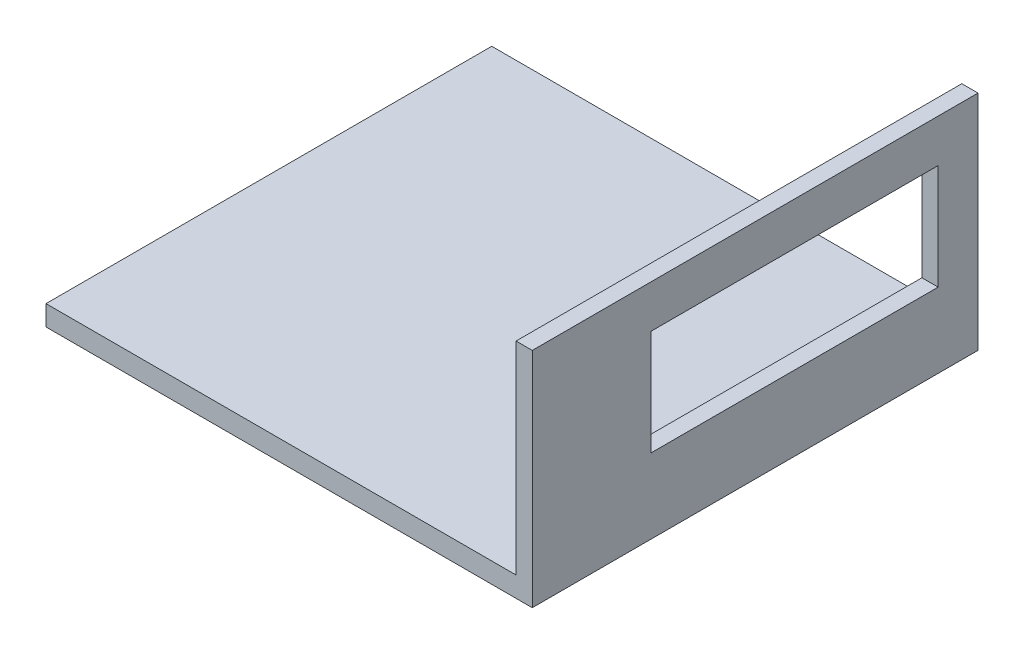
ISO-10303-21;
HEADER;
FILE_DESCRIPTION(('STEP AP214'),'2;1');
FILE_NAME('part.step','',(''),(''),'','','');
FILE_SCHEMA(('AUTOMOTIVE_DESIGN { 1 0 10303 214 1 1 1 1 }'));
ENDSEC;
DATA;
#1=APPLICATION_CONTEXT('core data for automotive mechanical design processes');
#2=APPLICATION_PROTOCOL_DEFINITION('international standard','automotive_design',2000,#1);
#3=PRODUCT_CONTEXT('',#1,'mechanical');
#4=PRODUCT('Part','Part','',(#3));
#5=PRODUCT_RELATED_PRODUCT_CATEGORY('part','',(#4));
#6=PRODUCT_DEFINITION_FORMATION('','',#4);
#7=PRODUCT_DEFINITION_CONTEXT('part definition',#1,'design');
#8=PRODUCT_DEFINITION('design','',#6,#7);
#9=PRODUCT_DEFINITION_SHAPE('','',#8);
#10=(LENGTH_UNIT() NAMED_UNIT(*) SI_UNIT(.MILLI.,.METRE.));
#11=(NAMED_UNIT(*) PLANE_ANGLE_UNIT() SI_UNIT($,.RADIAN.));
#12=(NAMED_UNIT(*) SI_UNIT($,.STERADIAN.) SOLID_ANGLE_UNIT());
#13=UNCERTAINTY_MEASURE_WITH_UNIT(LENGTH_MEASURE(1.E-05),#10,'distance_accuracy_value','');
#14=(GEOMETRIC_REPRESENTATION_CONTEXT(3) GLOBAL_UNCERTAINTY_ASSIGNED_CONTEXT((#13)) GLOBAL_UNIT_ASSIGNED_CONTEXT((#10,
#11,#12)) REPRESENTATION_CONTEXT('',''));
#15=CARTESIAN_POINT('',(0.,0.,0.));
#16=DIRECTION('',(0.,0.,1.));
#17=DIRECTION('',(1.,0.,0.));
#18=AXIS2_PLACEMENT_3D('',#15,#16,#17);
#19=CARTESIAN_POINT('',(0.,5.,0.));
#20=DIRECTION('',(0.,-1.,0.));
#21=DIRECTION('',(0.,0.,-1.));
#22=AXIS2_PLACEMENT_3D('',#19,#20,#21);
#23=PLANE('',#22);
#24=DIRECTION('',(0.,0.,1.));
#25=VECTOR('',#24,1.);
#26=CARTESIAN_POINT('',(56.,5.,55.));
#27=LINE('',#26,#25);
#28=CARTESIAN_POINT('',(55.9999999999999,5.,-55.));
#29=VERTEX_POINT('',#28);
#30=CARTESIAN_POINT('',(56.,5.,55.));
#31=VERTEX_POINT('',#30);
#32=EDGE_CURVE('E126',#29,#31,#27,.T.);
#33=ORIENTED_EDGE('',*,*,#32,.F.);
#34=DIRECTION('',(-1.,0.,0.));
#35=VECTOR('',#34,1.);
#36=CARTESIAN_POINT('',(-60.,5.,-55.));
#37=LINE('',#36,#35);
#38=CARTESIAN_POINT('',(-60.,5.,-55.));
#39=VERTEX_POINT('',#38);
#40=EDGE_CURVE('E192',#29,#39,#37,.T.);
#41=ORIENTED_EDGE('',*,*,#40,.T.);
#42=DIRECTION('',(0.,0.,1.));
#43=VECTOR('',#42,1.);
#44=CARTESIAN_POINT('',(-60.,5.,55.));
#45=LINE('',#44,#43);
#46=CARTESIAN_POINT('',(-60.,5.,55.));
#47=VERTEX_POINT('',#46);
#48=EDGE_CURVE('E199',#39,#47,#45,.T.);
#49=ORIENTED_EDGE('',*,*,#48,.T.);
#50=DIRECTION('',(1.,0.,0.));
#51=VECTOR('',#50,1.);
#52=CARTESIAN_POINT('',(-60.,5.,55.));
#53=LINE('',#52,#51);
#54=EDGE_CURVE('E168',#47,#31,#53,.T.);
#55=ORIENTED_EDGE('',*,*,#54,.T.);
#56=EDGE_LOOP('',(#33,#41,#49,#55));
#57=FACE_BOUND('',#56,.T.);
#58=ADVANCED_FACE('F33',(#57),#23,.F.);
#59=CARTESIAN_POINT('',(60.,5.,55.));
#60=DIRECTION('',(-1.,0.,0.));
#61=DIRECTION('',(0.,0.,1.));
#62=AXIS2_PLACEMENT_3D('',#59,#60,#61);
#63=PLANE('',#62);
#64=DIRECTION('',(0.,0.,-1.));
#65=VECTOR('',#64,1.);
#66=CARTESIAN_POINT('',(60.,18.4414610303207,25.7586442922975));
#67=LINE('',#66,#65);
#68=CARTESIAN_POINT('',(60.,18.4414610303207,25.7586442922975));
#69=VERTEX_POINT('',#68);
#70=CARTESIAN_POINT('',(60.,18.4414610303207,-45.1614693567457));
#71=VERTEX_POINT('',#70);
#72=EDGE_CURVE('E134',#69,#71,#67,.T.);
#73=ORIENTED_EDGE('',*,*,#72,.F.);
#74=DIRECTION('',(0.,-1.,0.));
#75=VECTOR('',#74,1.);
#76=CARTESIAN_POINT('',(60.,18.4414610303207,25.7586442922975));
#77=LINE('',#76,#75);
#78=CARTESIAN_POINT('',(60.,44.4295497391849,25.7586442922975));
#79=VERTEX_POINT('',#78);
#80=EDGE_CURVE('E50',#79,#69,#77,.T.);
#81=ORIENTED_EDGE('',*,*,#80,.F.);
#82=DIRECTION('',(0.,0.,1.));
#83=VECTOR('',#82,1.);
#84=CARTESIAN_POINT('',(60.,44.4295497391849,25.7586442922975));
#85=LINE('',#84,#83);
#86=CARTESIAN_POINT('',(60.,44.4295497391849,-45.1614693567457));
#87=VERTEX_POINT('',#86);
#88=EDGE_CURVE('E120',#87,#79,#85,.T.);
#89=ORIENTED_EDGE('',*,*,#88,.F.);
#90=DIRECTION('',(0.,1.,0.));
#91=VECTOR('',#90,1.);
#92=CARTESIAN_POINT('',(60.,18.4414610303207,-45.1614693567457));
#93=LINE('',#92,#91);
#94=EDGE_CURVE('E140',#71,#87,#93,.T.);
#95=ORIENTED_EDGE('',*,*,#94,.F.);
#96=EDGE_LOOP('',(#73,#81,#89,#95));
#97=FACE_BOUND('',#96,.T.);
#98=DIRECTION('',(0.,0.,-1.));
#99=VECTOR('',#98,1.);
#100=CARTESIAN_POINT('',(60.,0.,55.));
#101=LINE('',#100,#99);
#102=CARTESIAN_POINT('',(60.,0.,55.));
#103=VERTEX_POINT('',#102);
#104=CARTESIAN_POINT('',(60.,0.,-55.));
#105=VERTEX_POINT('',#104);
#106=EDGE_CURVE('E176',#103,#105,#101,.T.);
#107=ORIENTED_EDGE('',*,*,#106,.T.);
#108=DIRECTION('',(0.,-1.,0.));
#109=VECTOR('',#108,1.);
#110=CARTESIAN_POINT('',(60.,5.,-55.));
#111=LINE('',#110,#109);
#112=CARTESIAN_POINT('',(60.,55.,-55.));
#113=VERTEX_POINT('',#112);
#114=EDGE_CURVE('E11',#113,#105,#111,.T.);
#115=ORIENTED_EDGE('',*,*,#114,.F.);
#116=DIRECTION('',(0.,0.,-1.));
#117=VECTOR('',#116,1.);
#118=CARTESIAN_POINT('',(60.,55.,55.));
#119=LINE('',#118,#117);
#120=CARTESIAN_POINT('',(60.,55.,55.));
#121=VERTEX_POINT('',#120);
#122=EDGE_CURVE('E152',#121,#113,#119,.T.);
#123=ORIENTED_EDGE('',*,*,#122,.F.);
#124=DIRECTION('',(0.,-1.,0.));
#125=VECTOR('',#124,1.);
#126=CARTESIAN_POINT('',(60.,5.,55.));
#127=LINE('',#126,#125);
#128=EDGE_CURVE('E193',#121,#103,#127,.T.);
#129=ORIENTED_EDGE('',*,*,#128,.T.);
#130=EDGE_LOOP('',(#107,#115,#123,#129));
#131=FACE_BOUND('',#130,.T.);
#132=ADVANCED_FACE('F35',(#97,#131),#63,.F.);
#133=CARTESIAN_POINT('',(-60.,5.,-55.));
#134=DIRECTION('',(0.,0.,1.));
#135=DIRECTION('',(1.,0.,0.));
#136=AXIS2_PLACEMENT_3D('',#133,#134,#135);
#137=PLANE('',#136);
#138=DIRECTION('',(-1.,0.,0.));
#139=VECTOR('',#138,1.);
#140=CARTESIAN_POINT('',(-60.,0.,-55.));
#141=LINE('',#140,#139);
#142=CARTESIAN_POINT('',(-60.,0.,-55.));
#143=VERTEX_POINT('',#142);
#144=EDGE_CURVE('E180',#105,#143,#141,.T.);
#145=ORIENTED_EDGE('',*,*,#144,.T.);
#146=DIRECTION('',(0.,-1.,0.));
#147=VECTOR('',#146,1.);
#148=CARTESIAN_POINT('',(-60.,5.,-55.));
#149=LINE('',#148,#147);
#150=EDGE_CURVE('E42',#39,#143,#149,.T.);
#151=ORIENTED_EDGE('',*,*,#150,.F.);
#152=ORIENTED_EDGE('',*,*,#40,.F.);
#153=DIRECTION('',(0.,-1.,0.));
#154=VECTOR('',#153,1.);
#155=CARTESIAN_POINT('',(56.,55.,-55.));
#156=LINE('',#155,#154);
#157=CARTESIAN_POINT('',(56.,55.,-55.));
#158=VERTEX_POINT('',#157);
#159=EDGE_CURVE('E173',#158,#29,#156,.T.);
#160=ORIENTED_EDGE('',*,*,#159,.F.);
#161=DIRECTION('',(-1.,0.,0.));
#162=VECTOR('',#161,1.);
#163=CARTESIAN_POINT('',(60.,55.,-55.));
#164=LINE('',#163,#162);
#165=EDGE_CURVE('E155',#113,#158,#164,.T.);
#166=ORIENTED_EDGE('',*,*,#165,.F.);
#167=ORIENTED_EDGE('',*,*,#114,.T.);
#168=EDGE_LOOP('',(#145,#151,#152,#160,#166,#167));
#169=FACE_BOUND('',#168,.T.);
#170=ADVANCED_FACE('F215',(#169),#137,.F.);
#171=CARTESIAN_POINT('',(-60.,5.,55.));
#172=DIRECTION('',(1.,0.,0.));
#173=DIRECTION('',(0.,0.,-1.));
#174=AXIS2_PLACEMENT_3D('',#171,#172,#173);
#175=PLANE('',#174);
#176=DIRECTION('',(0.,0.,1.));
#177=VECTOR('',#176,1.);
#178=CARTESIAN_POINT('',(-60.,0.,55.));
#179=LINE('',#178,#177);
#180=CARTESIAN_POINT('',(-60.,0.,55.));
#181=VERTEX_POINT('',#180);
#182=EDGE_CURVE('E185',#143,#181,#179,.T.);
#183=ORIENTED_EDGE('',*,*,#182,.T.);
#184=DIRECTION('',(0.,-1.,0.));
#185=VECTOR('',#184,1.);
#186=CARTESIAN_POINT('',(-60.,5.,55.));
#187=LINE('',#186,#185);
#188=EDGE_CURVE('E195',#47,#181,#187,.T.);
#189=ORIENTED_EDGE('',*,*,#188,.F.);
#190=ORIENTED_EDGE('',*,*,#48,.F.);
#191=ORIENTED_EDGE('',*,*,#150,.T.);
#192=EDGE_LOOP('',(#183,#189,#190,#191));
#193=FACE_BOUND('',#192,.T.);
#194=ADVANCED_FACE('F218',(#193),#175,.F.);
#195=CARTESIAN_POINT('',(-60.,5.,55.));
#196=DIRECTION('',(0.,0.,-1.));
#197=DIRECTION('',(-1.,0.,0.));
#198=AXIS2_PLACEMENT_3D('',#195,#196,#197);
#199=PLANE('',#198);
#200=DIRECTION('',(1.,0.,0.));
#201=VECTOR('',#200,1.);
#202=CARTESIAN_POINT('',(-60.,0.,55.));
#203=LINE('',#202,#201);
#204=EDGE_CURVE('E190',#181,#103,#203,.T.);
#205=ORIENTED_EDGE('',*,*,#204,.T.);
#206=ORIENTED_EDGE('',*,*,#128,.F.);
#207=DIRECTION('',(1.,0.,0.));
#208=VECTOR('',#207,1.);
#209=CARTESIAN_POINT('',(60.,55.,55.));
#210=LINE('',#209,#208);
#211=CARTESIAN_POINT('',(56.,55.,55.));
#212=VERTEX_POINT('',#211);
#213=EDGE_CURVE('E149',#212,#121,#210,.T.);
#214=ORIENTED_EDGE('',*,*,#213,.F.);
#215=DIRECTION('',(0.,-1.,0.));
#216=VECTOR('',#215,1.);
#217=CARTESIAN_POINT('',(56.,55.,55.));
#218=LINE('',#217,#216);
#219=EDGE_CURVE('E159',#212,#31,#218,.T.);
#220=ORIENTED_EDGE('',*,*,#219,.T.);
#221=ORIENTED_EDGE('',*,*,#54,.F.);
#222=ORIENTED_EDGE('',*,*,#188,.T.);
#223=EDGE_LOOP('',(#205,#206,#214,#220,#221,#222));
#224=FACE_BOUND('',#223,.T.);
#225=ADVANCED_FACE('F209',(#224),#199,.F.);
#226=CARTESIAN_POINT('',(0.,0.,0.));
#227=DIRECTION('',(0.,-1.,0.));
#228=DIRECTION('',(0.,0.,-1.));
#229=AXIS2_PLACEMENT_3D('',#226,#227,#228);
#230=PLANE('',#229);
#231=ORIENTED_EDGE('',*,*,#106,.F.);
#232=ORIENTED_EDGE('',*,*,#204,.F.);
#233=ORIENTED_EDGE('',*,*,#182,.F.);
#234=ORIENTED_EDGE('',*,*,#144,.F.);
#235=EDGE_LOOP('',(#231,#232,#233,#234));
#236=FACE_BOUND('',#235,.T.);
#237=ADVANCED_FACE('F221',(#236),#230,.T.);
#238=CARTESIAN_POINT('',(56.,55.,55.));
#239=DIRECTION('',(1.,0.,0.));
#240=DIRECTION('',(0.,0.,-1.));
#241=AXIS2_PLACEMENT_3D('',#238,#239,#240);
#242=PLANE('',#241);
#243=DIRECTION('',(0.,0.,-1.));
#244=VECTOR('',#243,1.);
#245=CARTESIAN_POINT('',(56.,44.4295497391849,25.7586442922975));
#246=LINE('',#245,#244);
#247=CARTESIAN_POINT('',(56.,44.4295497391849,25.7586442922975));
#248=VERTEX_POINT('',#247);
#249=CARTESIAN_POINT('',(56.,44.4295497391849,-45.1614693567457));
#250=VERTEX_POINT('',#249);
#251=EDGE_CURVE('E132',#248,#250,#246,.T.);
#252=ORIENTED_EDGE('',*,*,#251,.F.);
#253=DIRECTION('',(0.,1.,0.));
#254=VECTOR('',#253,1.);
#255=CARTESIAN_POINT('',(56.,18.4414610303207,25.7586442922975));
#256=LINE('',#255,#254);
#257=CARTESIAN_POINT('',(56.,18.4414610303207,25.7586442922975));
#258=VERTEX_POINT('',#257);
#259=EDGE_CURVE('E114',#258,#248,#256,.T.);
#260=ORIENTED_EDGE('',*,*,#259,.F.);
#261=DIRECTION('',(0.,0.,1.));
#262=VECTOR('',#261,1.);
#263=CARTESIAN_POINT('',(56.,18.4414610303207,25.7586442922975));
#264=LINE('',#263,#262);
#265=CARTESIAN_POINT('',(56.,18.4414610303207,-45.1614693567457));
#266=VERTEX_POINT('',#265);
#267=EDGE_CURVE('E123',#266,#258,#264,.T.);
#268=ORIENTED_EDGE('',*,*,#267,.F.);
#269=DIRECTION('',(0.,-1.,0.));
#270=VECTOR('',#269,1.);
#271=CARTESIAN_POINT('',(56.,18.4414610303207,-45.1614693567457));
#272=LINE('',#271,#270);
#273=EDGE_CURVE('E58',#250,#266,#272,.T.);
#274=ORIENTED_EDGE('',*,*,#273,.F.);
#275=EDGE_LOOP('',(#252,#260,#268,#274));
#276=FACE_BOUND('',#275,.T.);
#277=ORIENTED_EDGE('',*,*,#32,.T.);
#278=ORIENTED_EDGE('',*,*,#219,.F.);
#279=DIRECTION('',(0.,0.,1.));
#280=VECTOR('',#279,1.);
#281=CARTESIAN_POINT('',(56.,55.,55.));
#282=LINE('',#281,#280);
#283=EDGE_CURVE('E157',#158,#212,#282,.T.);
#284=ORIENTED_EDGE('',*,*,#283,.F.);
#285=ORIENTED_EDGE('',*,*,#159,.T.);
#286=EDGE_LOOP('',(#277,#278,#284,#285));
#287=FACE_BOUND('',#286,.T.);
#288=ADVANCED_FACE('F129',(#276,#287),#242,.F.);
#289=CARTESIAN_POINT('',(0.,55.,0.));
#290=DIRECTION('',(0.,-1.,0.));
#291=DIRECTION('',(0.,0.,-1.));
#292=AXIS2_PLACEMENT_3D('',#289,#290,#291);
#293=PLANE('',#292);
#294=ORIENTED_EDGE('',*,*,#213,.T.);
#295=ORIENTED_EDGE('',*,*,#122,.T.);
#296=ORIENTED_EDGE('',*,*,#165,.T.);
#297=ORIENTED_EDGE('',*,*,#283,.T.);
#298=EDGE_LOOP('',(#294,#295,#296,#297));
#299=FACE_BOUND('',#298,.T.);
#300=ADVANCED_FACE('F212',(#299),#293,.F.);
#301=CARTESIAN_POINT('',(-60.001025,18.4414610303207,25.7586442922975));
#302=DIRECTION('',(0.,0.,1.));
#303=DIRECTION('',(1.,0.,0.));
#304=AXIS2_PLACEMENT_3D('',#301,#302,#303);
#305=PLANE('',#304);
#306=ORIENTED_EDGE('',*,*,#259,.T.);
#307=DIRECTION('',(1.,0.,0.));
#308=VECTOR('',#307,1.);
#309=CARTESIAN_POINT('',(-60.001025,44.4295497391849,25.7586442922975));
#310=LINE('',#309,#308);
#311=EDGE_CURVE('E127',#248,#79,#310,.T.);
#312=ORIENTED_EDGE('',*,*,#311,.T.);
#313=ORIENTED_EDGE('',*,*,#80,.T.);
#314=DIRECTION('',(1.,0.,0.));
#315=VECTOR('',#314,1.);
#316=CARTESIAN_POINT('',(-60.001025,18.4414610303207,25.7586442922975));
#317=LINE('',#316,#315);
#318=EDGE_CURVE('E110',#258,#69,#317,.T.);
#319=ORIENTED_EDGE('',*,*,#318,.F.);
#320=EDGE_LOOP('',(#306,#312,#313,#319));
#321=FACE_BOUND('',#320,.T.);
#322=ADVANCED_FACE('F112',(#321),#305,.F.);
#323=CARTESIAN_POINT('',(-60.001025,44.4295497391849,25.7586442922975));
#324=DIRECTION('',(0.,1.,0.));
#325=DIRECTION('',(0.,0.,1.));
#326=AXIS2_PLACEMENT_3D('',#323,#324,#325);
#327=PLANE('',#326);
#328=ORIENTED_EDGE('',*,*,#251,.T.);
#329=DIRECTION('',(1.,0.,0.));
#330=VECTOR('',#329,1.);
#331=CARTESIAN_POINT('',(-60.001025,44.4295497391849,-45.1614693567457));
#332=LINE('',#331,#330);
#333=EDGE_CURVE('E146',#250,#87,#332,.T.);
#334=ORIENTED_EDGE('',*,*,#333,.T.);
#335=ORIENTED_EDGE('',*,*,#88,.T.);
#336=ORIENTED_EDGE('',*,*,#311,.F.);
#337=EDGE_LOOP('',(#328,#334,#335,#336));
#338=FACE_BOUND('',#337,.T.);
#339=ADVANCED_FACE('F235',(#338),#327,.F.);
#340=CARTESIAN_POINT('',(-60.001025,18.4414610303207,-45.1614693567457));
#341=DIRECTION('',(0.,0.,-1.));
#342=DIRECTION('',(-1.,0.,0.));
#343=AXIS2_PLACEMENT_3D('',#340,#341,#342);
#344=PLANE('',#343);
#345=ORIENTED_EDGE('',*,*,#273,.T.);
#346=DIRECTION('',(1.,0.,0.));
#347=VECTOR('',#346,1.);
#348=CARTESIAN_POINT('',(-60.001025,18.4414610303207,-45.1614693567457));
#349=LINE('',#348,#347);
#350=EDGE_CURVE('E119',#266,#71,#349,.T.);
#351=ORIENTED_EDGE('',*,*,#350,.T.);
#352=ORIENTED_EDGE('',*,*,#94,.T.);
#353=ORIENTED_EDGE('',*,*,#333,.F.);
#354=EDGE_LOOP('',(#345,#351,#352,#353));
#355=FACE_BOUND('',#354,.T.);
#356=ADVANCED_FACE('F233',(#355),#344,.F.);
#357=CARTESIAN_POINT('',(-60.001025,18.4414610303207,25.7586442922975));
#358=DIRECTION('',(0.,-1.,0.));
#359=DIRECTION('',(0.,0.,-1.));
#360=AXIS2_PLACEMENT_3D('',#357,#358,#359);
#361=PLANE('',#360);
#362=ORIENTED_EDGE('',*,*,#267,.T.);
#363=ORIENTED_EDGE('',*,*,#318,.T.);
#364=ORIENTED_EDGE('',*,*,#72,.T.);
#365=ORIENTED_EDGE('',*,*,#350,.F.);
#366=EDGE_LOOP('',(#362,#363,#364,#365));
#367=FACE_BOUND('',#366,.T.);
#368=ADVANCED_FACE('F124',(#367),#361,.F.);
#369=CLOSED_SHELL('',(#58,#132,#170,#194,#225,#237,#288,#300,#322,#339,#356,#368));
#370=MANIFOLD_SOLID_BREP('B2',#369);
#371=ADVANCED_BREP_SHAPE_REPRESENTATION('',(#18,#370),#14);
#372=SHAPE_DEFINITION_REPRESENTATION(#9,#371);
ENDSEC;
END-ISO-10303-21;
